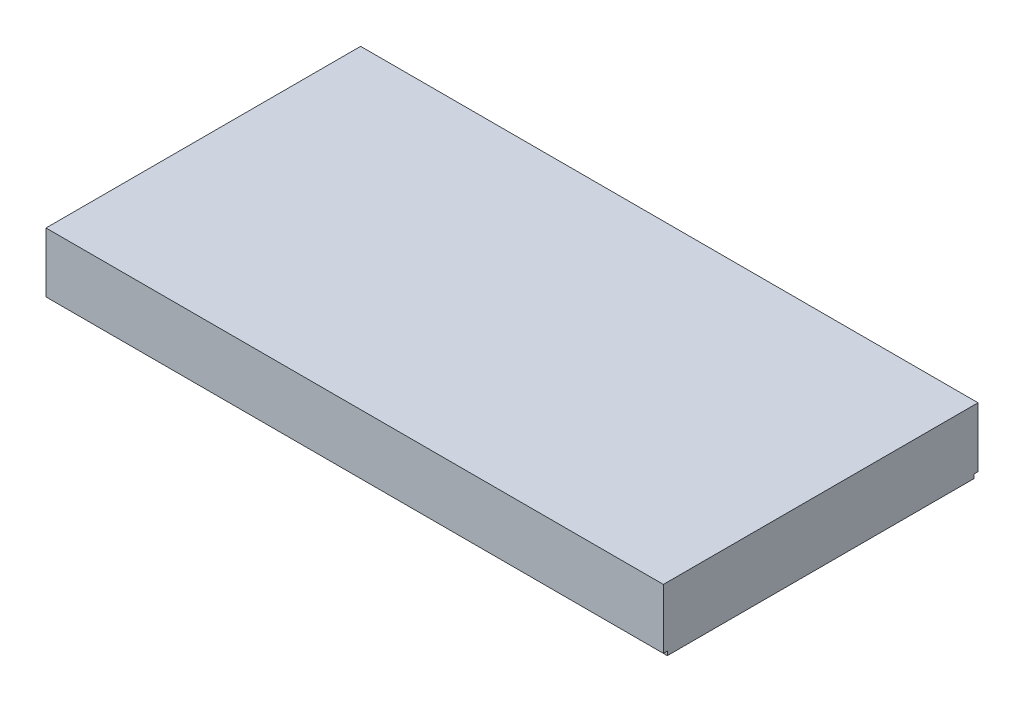
ISO-10303-21;
HEADER;
FILE_DESCRIPTION(('STEP AP214'),'2;1');
FILE_NAME('part.step','',(''),(''),'','','');
FILE_SCHEMA(('AUTOMOTIVE_DESIGN { 1 0 10303 214 1 1 1 1 }'));
ENDSEC;
DATA;
#1=APPLICATION_CONTEXT('core data for automotive mechanical design processes');
#2=APPLICATION_PROTOCOL_DEFINITION('international standard','automotive_design',2000,#1);
#3=PRODUCT_CONTEXT('',#1,'mechanical');
#4=PRODUCT('Part','Part','',(#3));
#5=PRODUCT_RELATED_PRODUCT_CATEGORY('part','',(#4));
#6=PRODUCT_DEFINITION_FORMATION('','',#4);
#7=PRODUCT_DEFINITION_CONTEXT('part definition',#1,'design');
#8=PRODUCT_DEFINITION('design','',#6,#7);
#9=PRODUCT_DEFINITION_SHAPE('','',#8);
#10=(LENGTH_UNIT() NAMED_UNIT(*) SI_UNIT(.MILLI.,.METRE.));
#11=(NAMED_UNIT(*) PLANE_ANGLE_UNIT() SI_UNIT($,.RADIAN.));
#12=(NAMED_UNIT(*) SI_UNIT($,.STERADIAN.) SOLID_ANGLE_UNIT());
#13=UNCERTAINTY_MEASURE_WITH_UNIT(LENGTH_MEASURE(1.E-05),#10,'distance_accuracy_value','');
#14=(GEOMETRIC_REPRESENTATION_CONTEXT(3) GLOBAL_UNCERTAINTY_ASSIGNED_CONTEXT((#13)) GLOBAL_UNIT_ASSIGNED_CONTEXT((#10,
#11,#12)) REPRESENTATION_CONTEXT('',''));
#15=CARTESIAN_POINT('',(0.,0.,0.));
#16=DIRECTION('',(0.,0.,1.));
#17=DIRECTION('',(1.,0.,0.));
#18=AXIS2_PLACEMENT_3D('',#15,#16,#17);
#19=CARTESIAN_POINT('',(0.681967213114738,0.,7.9));
#20=DIRECTION('',(0.,1.,0.));
#21=DIRECTION('',(0.,0.,1.));
#22=AXIS2_PLACEMENT_3D('',#19,#20,#21);
#23=PLANE('',#22);
#24=DIRECTION('',(1.,0.,0.));
#25=VECTOR('',#24,1.);
#26=CARTESIAN_POINT('',(48.2819672131147,0.,7.7));
#27=LINE('',#26,#25);
#28=CARTESIAN_POINT('',(1.09391234573703,0.,7.7));
#29=VERTEX_POINT('',#28);
#30=CARTESIAN_POINT('',(32.0973784672658,0.,7.7));
#31=VERTEX_POINT('',#30);
#32=EDGE_CURVE('E258',#29,#31,#27,.T.);
#33=ORIENTED_EDGE('',*,*,#32,.F.);
#34=DIRECTION('',(0.,0.,-1.));
#35=VECTOR('',#34,1.);
#36=CARTESIAN_POINT('',(1.09391234573703,0.,7.9));
#37=LINE('',#36,#35);
#38=CARTESIAN_POINT('',(1.09391234573703,0.,-7.7));
#39=VERTEX_POINT('',#38);
#40=EDGE_CURVE('E67',#29,#39,#37,.T.);
#41=ORIENTED_EDGE('',*,*,#40,.T.);
#42=DIRECTION('',(-1.,0.,0.));
#43=VECTOR('',#42,1.);
#44=CARTESIAN_POINT('',(0.881967213114738,0.,-7.7));
#45=LINE('',#44,#43);
#46=CARTESIAN_POINT('',(32.0973784672658,0.,-7.7));
#47=VERTEX_POINT('',#46);
#48=EDGE_CURVE('E265',#47,#39,#45,.T.);
#49=ORIENTED_EDGE('',*,*,#48,.F.);
#50=DIRECTION('',(0.,0.,1.));
#51=VECTOR('',#50,1.);
#52=CARTESIAN_POINT('',(32.0973784672658,0.,7.9));
#53=LINE('',#52,#51);
#54=EDGE_CURVE('E377',#47,#31,#53,.T.);
#55=ORIENTED_EDGE('',*,*,#54,.T.);
#56=EDGE_LOOP('',(#33,#41,#49,#55));
#57=FACE_BOUND('',#56,.T.);
#58=DIRECTION('',(0.,0.,-1.));
#59=VECTOR('',#58,1.);
#60=CARTESIAN_POINT('',(31.3093235998881,0.,6.7));
#61=LINE('',#60,#59);
#62=CARTESIAN_POINT('',(31.3093235998881,0.,6.7));
#63=VERTEX_POINT('',#62);
#64=CARTESIAN_POINT('',(31.3093235998881,0.,-6.7));
#65=VERTEX_POINT('',#64);
#66=EDGE_CURVE('E315',#63,#65,#61,.T.);
#67=ORIENTED_EDGE('',*,*,#66,.T.);
#68=DIRECTION('',(1.,0.,0.));
#69=VECTOR('',#68,1.);
#70=CARTESIAN_POINT('',(0.,0.,-6.7));
#71=LINE('',#70,#69);
#72=CARTESIAN_POINT('',(1.88196721311474,0.,-6.7));
#73=VERTEX_POINT('',#72);
#74=EDGE_CURVE('E293',#73,#65,#71,.T.);
#75=ORIENTED_EDGE('',*,*,#74,.F.);
#76=DIRECTION('',(0.,0.,-1.));
#77=VECTOR('',#76,1.);
#78=CARTESIAN_POINT('',(1.88196721311474,0.,7.9));
#79=LINE('',#78,#77);
#80=CARTESIAN_POINT('',(1.88196721311474,0.,6.7));
#81=VERTEX_POINT('',#80);
#82=EDGE_CURVE('E197',#81,#73,#79,.T.);
#83=ORIENTED_EDGE('',*,*,#82,.F.);
#84=DIRECTION('',(1.,0.,0.));
#85=VECTOR('',#84,1.);
#86=CARTESIAN_POINT('',(0.,0.,6.7));
#87=LINE('',#86,#85);
#88=EDGE_CURVE('E200',#81,#63,#87,.T.);
#89=ORIENTED_EDGE('',*,*,#88,.T.);
#90=EDGE_LOOP('',(#67,#75,#83,#89));
#91=FACE_BOUND('',#90,.T.);
#92=ADVANCED_FACE('F42',(#57,#91),#23,.F.);
#93=CARTESIAN_POINT('',(0.681967213114738,3.2,7.9));
#94=DIRECTION('',(0.,-1.,0.));
#95=DIRECTION('',(1.,0.,0.));
#96=AXIS2_PLACEMENT_3D('',#93,#94,#95);
#97=PLANE('',#96);
#98=DIRECTION('',(-1.,0.,0.));
#99=VECTOR('',#98,1.);
#100=CARTESIAN_POINT('',(0.681967213114738,3.2,-7.9));
#101=LINE('',#100,#99);
#102=CARTESIAN_POINT('',(32.0973784672658,3.2,-7.9));
#103=VERTEX_POINT('',#102);
#104=CARTESIAN_POINT('',(1.09391234573703,3.2,-7.9));
#105=VERTEX_POINT('',#104);
#106=EDGE_CURVE('E186',#103,#105,#101,.T.);
#107=ORIENTED_EDGE('',*,*,#106,.T.);
#108=DIRECTION('',(0.,0.,-1.));
#109=VECTOR('',#108,1.);
#110=CARTESIAN_POINT('',(1.09391234573703,3.2,-7.9));
#111=LINE('',#110,#109);
#112=CARTESIAN_POINT('',(1.09391234573703,3.2,7.9));
#113=VERTEX_POINT('',#112);
#114=EDGE_CURVE('E169',#113,#105,#111,.T.);
#115=ORIENTED_EDGE('',*,*,#114,.F.);
#116=DIRECTION('',(-1.,0.,0.));
#117=VECTOR('',#116,1.);
#118=CARTESIAN_POINT('',(0.681967213114738,3.2,7.9));
#119=LINE('',#118,#117);
#120=CARTESIAN_POINT('',(32.0973784672658,3.2,7.9));
#121=VERTEX_POINT('',#120);
#122=EDGE_CURVE('E184',#121,#113,#119,.T.);
#123=ORIENTED_EDGE('',*,*,#122,.F.);
#124=DIRECTION('',(0.,0.,1.));
#125=VECTOR('',#124,1.);
#126=CARTESIAN_POINT('',(32.0973784672658,3.2,-7.9));
#127=LINE('',#126,#125);
#128=EDGE_CURVE('E187',#103,#121,#127,.T.);
#129=ORIENTED_EDGE('',*,*,#128,.F.);
#130=EDGE_LOOP('',(#107,#115,#123,#129));
#131=FACE_BOUND('',#130,.T.);
#132=ADVANCED_FACE('F182',(#131),#97,.F.);
#133=CARTESIAN_POINT('',(0.,0.,7.9));
#134=DIRECTION('',(0.,0.,-1.));
#135=DIRECTION('',(-1.,0.,0.));
#136=AXIS2_PLACEMENT_3D('',#133,#134,#135);
#137=PLANE('',#136);
#138=ORIENTED_EDGE('',*,*,#122,.T.);
#139=DIRECTION('',(0.,1.,0.));
#140=VECTOR('',#139,1.);
#141=CARTESIAN_POINT('',(1.09391234573703,-0.2,7.9));
#142=LINE('',#141,#140);
#143=CARTESIAN_POINT('',(1.09391234573703,0.199766915545216,7.9));
#144=VERTEX_POINT('',#143);
#145=EDGE_CURVE('E166',#144,#113,#142,.T.);
#146=ORIENTED_EDGE('',*,*,#145,.F.);
#147=DIRECTION('',(-1.,0.,0.));
#148=VECTOR('',#147,1.);
#149=CARTESIAN_POINT('',(0.881967213114738,0.199766915545217,7.9));
#150=LINE('',#149,#148);
#151=CARTESIAN_POINT('',(32.0973784672658,0.199766915545216,7.9));
#152=VERTEX_POINT('',#151);
#153=EDGE_CURVE('E274',#152,#144,#150,.T.);
#154=ORIENTED_EDGE('',*,*,#153,.F.);
#155=DIRECTION('',(0.,1.,0.));
#156=VECTOR('',#155,1.);
#157=CARTESIAN_POINT('',(32.0973784672658,-0.2,7.9));
#158=LINE('',#157,#156);
#159=EDGE_CURVE('E191',#152,#121,#158,.T.);
#160=ORIENTED_EDGE('',*,*,#159,.T.);
#161=EDGE_LOOP('',(#138,#146,#154,#160));
#162=FACE_BOUND('',#161,.T.);
#163=ADVANCED_FACE('F190',(#162),#137,.F.);
#164=CARTESIAN_POINT('',(0.,0.,-7.9));
#165=DIRECTION('',(0.,0.,-1.));
#166=DIRECTION('',(-1.,0.,0.));
#167=AXIS2_PLACEMENT_3D('',#164,#165,#166);
#168=PLANE('',#167);
#169=DIRECTION('',(0.,1.,0.));
#170=VECTOR('',#169,1.);
#171=CARTESIAN_POINT('',(1.09391234573703,-0.2,-7.9));
#172=LINE('',#171,#170);
#173=CARTESIAN_POINT('',(1.09391234573703,0.199783174331497,-7.9));
#174=VERTEX_POINT('',#173);
#175=EDGE_CURVE('E177',#174,#105,#172,.T.);
#176=ORIENTED_EDGE('',*,*,#175,.T.);
#177=ORIENTED_EDGE('',*,*,#106,.F.);
#178=DIRECTION('',(0.,1.,0.));
#179=VECTOR('',#178,1.);
#180=CARTESIAN_POINT('',(32.0973784672658,-0.2,-7.9));
#181=LINE('',#180,#179);
#182=CARTESIAN_POINT('',(32.0973784672658,0.202161519723774,-7.9));
#183=VERTEX_POINT('',#182);
#184=EDGE_CURVE('E381',#183,#103,#181,.T.);
#185=ORIENTED_EDGE('',*,*,#184,.F.);
#186=DIRECTION('',(0.999999997057616,7.67122416557049E-05,0.));
#187=VECTOR('',#186,1.);
#188=CARTESIAN_POINT('',(48.4819672131147,0.203418418258773,-7.9));
#189=LINE('',#188,#187);
#190=EDGE_CURVE('E262',#174,#183,#189,.T.);
#191=ORIENTED_EDGE('',*,*,#190,.F.);
#192=EDGE_LOOP('',(#176,#177,#185,#191));
#193=FACE_BOUND('',#192,.T.);
#194=ADVANCED_FACE('F386',(#193),#168,.T.);
#195=CARTESIAN_POINT('',(1.88196721311474,0.,7.9));
#196=DIRECTION('',(1.,0.,0.));
#197=DIRECTION('',(0.,0.,-1.));
#198=AXIS2_PLACEMENT_3D('',#195,#196,#197);
#199=PLANE('',#198);
#200=DIRECTION('',(0.,-1.,0.));
#201=VECTOR('',#200,1.);
#202=CARTESIAN_POINT('',(1.88196721311474,2.4,-2.49948215339272));
#203=LINE('',#202,#201);
#204=CARTESIAN_POINT('',(1.88196721311474,2.2,-2.49948215339272));
#205=VERTEX_POINT('',#204);
#206=CARTESIAN_POINT('',(1.88196721311474,2.,-2.49948215339272));
#207=VERTEX_POINT('',#206);
#208=EDGE_CURVE('E336',#205,#207,#203,.T.);
#209=ORIENTED_EDGE('',*,*,#208,.F.);
#210=DIRECTION('',(0.,0.,-1.));
#211=VECTOR('',#210,1.);
#212=CARTESIAN_POINT('',(1.88196721311474,2.2,7.9));
#213=LINE('',#212,#211);
#214=CARTESIAN_POINT('',(1.88196721311474,2.2,2.50210016185098));
#215=VERTEX_POINT('',#214);
#216=EDGE_CURVE('E230',#205,#215,#213,.F.);
#217=ORIENTED_EDGE('',*,*,#216,.T.);
#218=DIRECTION('',(0.,-1.,0.));
#219=VECTOR('',#218,1.);
#220=CARTESIAN_POINT('',(1.88196721311474,2.4,2.50210016185098));
#221=LINE('',#220,#219);
#222=CARTESIAN_POINT('',(1.88196721311474,2.,2.50210016185098));
#223=VERTEX_POINT('',#222);
#224=EDGE_CURVE('E267',#215,#223,#221,.T.);
#225=ORIENTED_EDGE('',*,*,#224,.T.);
#226=DIRECTION('',(0.,0.,-1.));
#227=VECTOR('',#226,1.);
#228=CARTESIAN_POINT('',(1.88196721311474,2.,7.9));
#229=LINE('',#228,#227);
#230=CARTESIAN_POINT('',(1.88196721311474,2.,6.7));
#231=VERTEX_POINT('',#230);
#232=EDGE_CURVE('E297',#231,#223,#229,.T.);
#233=ORIENTED_EDGE('',*,*,#232,.F.);
#234=DIRECTION('',(0.,-1.,0.));
#235=VECTOR('',#234,1.);
#236=CARTESIAN_POINT('',(1.88196721311474,0.,6.7));
#237=LINE('',#236,#235);
#238=EDGE_CURVE('E294',#231,#81,#237,.T.);
#239=ORIENTED_EDGE('',*,*,#238,.T.);
#240=ORIENTED_EDGE('',*,*,#82,.T.);
#241=DIRECTION('',(0.,-1.,0.));
#242=VECTOR('',#241,1.);
#243=CARTESIAN_POINT('',(1.88196721311474,0.,-6.7));
#244=LINE('',#243,#242);
#245=CARTESIAN_POINT('',(1.88196721311474,2.,-6.7));
#246=VERTEX_POINT('',#245);
#247=EDGE_CURVE('E206',#246,#73,#244,.T.);
#248=ORIENTED_EDGE('',*,*,#247,.F.);
#249=EDGE_CURVE('E300',#207,#246,#229,.T.);
#250=ORIENTED_EDGE('',*,*,#249,.F.);
#251=EDGE_LOOP('',(#209,#217,#225,#233,#239,#240,#248,#250));
#252=FACE_BOUND('',#251,.T.);
#253=ADVANCED_FACE('F356',(#252),#199,.T.);
#254=CARTESIAN_POINT('',(0.681967213114738,2.,7.9));
#255=DIRECTION('',(0.,-1.,0.));
#256=DIRECTION('',(1.,0.,0.));
#257=AXIS2_PLACEMENT_3D('',#254,#255,#256);
#258=PLANE('',#257);
#259=DIRECTION('',(0.,0.,-1.));
#260=VECTOR('',#259,1.);
#261=CARTESIAN_POINT('',(31.3093235998881,2.,6.7));
#262=LINE('',#261,#260);
#263=CARTESIAN_POINT('',(31.3093235998881,2.,6.7));
#264=VERTEX_POINT('',#263);
#265=CARTESIAN_POINT('',(31.3093235998881,2.,-6.7));
#266=VERTEX_POINT('',#265);
#267=EDGE_CURVE('E324',#264,#266,#262,.T.);
#268=ORIENTED_EDGE('',*,*,#267,.F.);
#269=DIRECTION('',(-1.,0.,0.));
#270=VECTOR('',#269,1.);
#271=CARTESIAN_POINT('',(0.,2.,6.7));
#272=LINE('',#271,#270);
#273=EDGE_CURVE('E302',#264,#231,#272,.T.);
#274=ORIENTED_EDGE('',*,*,#273,.T.);
#275=ORIENTED_EDGE('',*,*,#232,.T.);
#276=DIRECTION('',(-1.,0.,0.));
#277=VECTOR('',#276,1.);
#278=CARTESIAN_POINT('',(1.88196721311474,2.,2.50210016185098));
#279=LINE('',#278,#277);
#280=CARTESIAN_POINT('',(2.38194248084373,2.,2.50210016185098));
#281=VERTEX_POINT('',#280);
#282=EDGE_CURVE('E333',#281,#223,#279,.T.);
#283=ORIENTED_EDGE('',*,*,#282,.F.);
#284=DIRECTION('',(0.,0.,1.));
#285=VECTOR('',#284,1.);
#286=CARTESIAN_POINT('',(2.38194248084373,2.,2.50210016185098));
#287=LINE('',#286,#285);
#288=CARTESIAN_POINT('',(2.38194248084373,2.,-2.49948215339272));
#289=VERTEX_POINT('',#288);
#290=EDGE_CURVE('E330',#289,#281,#287,.T.);
#291=ORIENTED_EDGE('',*,*,#290,.F.);
#292=DIRECTION('',(1.,0.,0.));
#293=VECTOR('',#292,1.);
#294=CARTESIAN_POINT('',(2.38194248084373,2.,-2.49948215339272));
#295=LINE('',#294,#293);
#296=EDGE_CURVE('E250',#207,#289,#295,.T.);
#297=ORIENTED_EDGE('',*,*,#296,.F.);
#298=ORIENTED_EDGE('',*,*,#249,.T.);
#299=DIRECTION('',(-1.,0.,0.));
#300=VECTOR('',#299,1.);
#301=CARTESIAN_POINT('',(0.,2.,-6.7));
#302=LINE('',#301,#300);
#303=EDGE_CURVE('E296',#266,#246,#302,.T.);
#304=ORIENTED_EDGE('',*,*,#303,.F.);
#305=EDGE_LOOP('',(#268,#274,#275,#283,#291,#297,#298,#304));
#306=FACE_BOUND('',#305,.T.);
#307=CARTESIAN_POINT('',(16.5819672131147,2.,0.));
#308=DIRECTION('',(0.,-1.,0.));
#309=DIRECTION('',(1.,0.,0.));
#310=AXIS2_PLACEMENT_3D('',#307,#308,#309);
#311=CIRCLE('',#310,3.1);
#312=CARTESIAN_POINT('',(19.6819672131147,2.,0.));
#313=VERTEX_POINT('',#312);
#314=EDGE_CURVE('E214',#313,#313,#311,.F.);
#315=ORIENTED_EDGE('',*,*,#314,.T.);
#316=EDGE_LOOP('',(#315));
#317=FACE_BOUND('',#316,.T.);
#318=CARTESIAN_POINT('',(24.5819672131147,2.,0.));
#319=DIRECTION('',(0.,-1.,0.));
#320=DIRECTION('',(1.,0.,0.));
#321=AXIS2_PLACEMENT_3D('',#318,#319,#320);
#322=CIRCLE('',#321,3.1);
#323=CARTESIAN_POINT('',(27.6819672131147,2.,0.));
#324=VERTEX_POINT('',#323);
#325=EDGE_CURVE('E211',#324,#324,#322,.F.);
#326=ORIENTED_EDGE('',*,*,#325,.T.);
#327=EDGE_LOOP('',(#326));
#328=FACE_BOUND('',#327,.T.);
#329=CARTESIAN_POINT('',(8.58196721311474,2.,0.));
#330=DIRECTION('',(0.,-1.,0.));
#331=DIRECTION('',(1.,0.,0.));
#332=AXIS2_PLACEMENT_3D('',#329,#330,#331);
#333=CIRCLE('',#332,3.1);
#334=CARTESIAN_POINT('',(11.6819672131147,2.,0.));
#335=VERTEX_POINT('',#334);
#336=EDGE_CURVE('E203',#335,#335,#333,.F.);
#337=ORIENTED_EDGE('',*,*,#336,.T.);
#338=EDGE_LOOP('',(#337));
#339=FACE_BOUND('',#338,.T.);
#340=ADVANCED_FACE('F353',(#306,#317,#328,#339),#258,.T.);
#341=CARTESIAN_POINT('',(0.,0.,6.7));
#342=DIRECTION('',(0.,0.,-1.));
#343=DIRECTION('',(-1.,0.,0.));
#344=AXIS2_PLACEMENT_3D('',#341,#342,#343);
#345=PLANE('',#344);
#346=DIRECTION('',(0.,1.,0.));
#347=VECTOR('',#346,1.);
#348=CARTESIAN_POINT('',(31.3093235998881,0.,6.7));
#349=LINE('',#348,#347);
#350=EDGE_CURVE('E319',#63,#264,#349,.T.);
#351=ORIENTED_EDGE('',*,*,#350,.F.);
#352=ORIENTED_EDGE('',*,*,#88,.F.);
#353=ORIENTED_EDGE('',*,*,#238,.F.);
#354=ORIENTED_EDGE('',*,*,#273,.F.);
#355=EDGE_LOOP('',(#351,#352,#353,#354));
#356=FACE_BOUND('',#355,.T.);
#357=ADVANCED_FACE('F361',(#356),#345,.T.);
#358=CARTESIAN_POINT('',(0.,0.,-6.7));
#359=DIRECTION('',(0.,0.,-1.));
#360=DIRECTION('',(-1.,0.,0.));
#361=AXIS2_PLACEMENT_3D('',#358,#359,#360);
#362=PLANE('',#361);
#363=ORIENTED_EDGE('',*,*,#74,.T.);
#364=DIRECTION('',(0.,1.,0.));
#365=VECTOR('',#364,1.);
#366=CARTESIAN_POINT('',(31.3093235998881,0.,-6.7));
#367=LINE('',#366,#365);
#368=EDGE_CURVE('E242',#65,#266,#367,.T.);
#369=ORIENTED_EDGE('',*,*,#368,.T.);
#370=ORIENTED_EDGE('',*,*,#303,.T.);
#371=ORIENTED_EDGE('',*,*,#247,.T.);
#372=EDGE_LOOP('',(#363,#369,#370,#371));
#373=FACE_BOUND('',#372,.T.);
#374=ADVANCED_FACE('F308',(#373),#362,.F.);
#375=CARTESIAN_POINT('',(8.58196721311474,-0.2,0.));
#376=DIRECTION('',(0.,-1.,0.));
#377=DIRECTION('',(0.,0.,-1.));
#378=AXIS2_PLACEMENT_3D('',#375,#376,#377);
#379=PLANE('',#378);
#380=CARTESIAN_POINT('',(8.58196721311474,-0.2,0.));
#381=DIRECTION('',(0.,-1.,0.));
#382=DIRECTION('',(0.,0.,-1.));
#383=AXIS2_PLACEMENT_3D('',#380,#381,#382);
#384=CIRCLE('',#383,3.1);
#385=CARTESIAN_POINT('',(8.58196721311474,-0.2,-3.1));
#386=VERTEX_POINT('',#385);
#387=EDGE_CURVE('E207',#386,#386,#384,.T.);
#388=ORIENTED_EDGE('',*,*,#387,.T.);
#389=EDGE_LOOP('',(#388));
#390=FACE_BOUND('',#389,.T.);
#391=CARTESIAN_POINT('',(8.58196721311474,-0.2,0.));
#392=DIRECTION('',(0.,-1.,0.));
#393=DIRECTION('',(0.,0.,-1.));
#394=AXIS2_PLACEMENT_3D('',#391,#392,#393);
#395=CIRCLE('',#394,2.4);
#396=CARTESIAN_POINT('',(8.58196721311474,-0.2,-2.4));
#397=VERTEX_POINT('',#396);
#398=EDGE_CURVE('E221',#397,#397,#395,.T.);
#399=ORIENTED_EDGE('',*,*,#398,.F.);
#400=EDGE_LOOP('',(#399));
#401=FACE_BOUND('',#400,.T.);
#402=ADVANCED_FACE('F496',(#390,#401),#379,.T.);
#403=CARTESIAN_POINT('',(8.58196721311474,-0.2,0.));
#404=DIRECTION('',(0.,1.,0.));
#405=DIRECTION('',(0.,0.,1.));
#406=AXIS2_PLACEMENT_3D('',#403,#404,#405);
#407=CYLINDRICAL_SURFACE('',#406,3.1);
#408=ORIENTED_EDGE('',*,*,#336,.F.);
#409=EDGE_LOOP('',(#408));
#410=FACE_BOUND('',#409,.T.);
#411=ORIENTED_EDGE('',*,*,#387,.F.);
#412=EDGE_LOOP('',(#411));
#413=FACE_BOUND('',#412,.T.);
#414=ADVANCED_FACE('F494',(#410,#413),#407,.T.);
#415=CARTESIAN_POINT('',(8.58196721311474,-0.2,0.));
#416=DIRECTION('',(0.,1.,0.));
#417=DIRECTION('',(0.,0.,1.));
#418=AXIS2_PLACEMENT_3D('',#415,#416,#417);
#419=CYLINDRICAL_SURFACE('',#418,2.4);
#420=CARTESIAN_POINT('',(8.58196721311474,2.,0.));
#421=DIRECTION('',(0.,-1.,0.));
#422=DIRECTION('',(1.,0.,0.));
#423=AXIS2_PLACEMENT_3D('',#420,#421,#422);
#424=CIRCLE('',#423,2.4);
#425=CARTESIAN_POINT('',(10.9819672131147,2.,0.));
#426=VERTEX_POINT('',#425);
#427=EDGE_CURVE('E192',#426,#426,#424,.F.);
#428=ORIENTED_EDGE('',*,*,#427,.T.);
#429=EDGE_LOOP('',(#428));
#430=FACE_BOUND('',#429,.T.);
#431=ORIENTED_EDGE('',*,*,#398,.T.);
#432=EDGE_LOOP('',(#431));
#433=FACE_BOUND('',#432,.T.);
#434=ADVANCED_FACE('F491',(#430,#433),#419,.F.);
#435=ORIENTED_EDGE('',*,*,#427,.F.);
#436=EDGE_LOOP('',(#435));
#437=FACE_BOUND('',#436,.T.);
#438=ADVANCED_FACE('F486',(#437),#258,.T.);
#439=CARTESIAN_POINT('',(24.5819672131147,-0.2,0.));
#440=DIRECTION('',(0.,-1.,0.));
#441=DIRECTION('',(0.,0.,-1.));
#442=AXIS2_PLACEMENT_3D('',#439,#440,#441);
#443=PLANE('',#442);
#444=CARTESIAN_POINT('',(24.5819672131147,-0.2,0.));
#445=DIRECTION('',(0.,-1.,0.));
#446=DIRECTION('',(0.,0.,-1.));
#447=AXIS2_PLACEMENT_3D('',#444,#445,#446);
#448=CIRCLE('',#447,3.1);
#449=CARTESIAN_POINT('',(24.5819672131147,-0.2,-3.1));
#450=VERTEX_POINT('',#449);
#451=EDGE_CURVE('E280',#450,#450,#448,.T.);
#452=ORIENTED_EDGE('',*,*,#451,.T.);
#453=EDGE_LOOP('',(#452));
#454=FACE_BOUND('',#453,.T.);
#455=CARTESIAN_POINT('',(24.5819672131147,-0.2,0.));
#456=DIRECTION('',(0.,-1.,0.));
#457=DIRECTION('',(0.,0.,-1.));
#458=AXIS2_PLACEMENT_3D('',#455,#456,#457);
#459=CIRCLE('',#458,2.4);
#460=CARTESIAN_POINT('',(24.5819672131147,-0.2,-2.4));
#461=VERTEX_POINT('',#460);
#462=EDGE_CURVE('E276',#461,#461,#459,.T.);
#463=ORIENTED_EDGE('',*,*,#462,.F.);
#464=EDGE_LOOP('',(#463));
#465=FACE_BOUND('',#464,.T.);
#466=ADVANCED_FACE('F483',(#454,#465),#443,.T.);
#467=CARTESIAN_POINT('',(24.5819672131147,-0.2,0.));
#468=DIRECTION('',(0.,1.,0.));
#469=DIRECTION('',(0.,0.,1.));
#470=AXIS2_PLACEMENT_3D('',#467,#468,#469);
#471=CYLINDRICAL_SURFACE('',#470,3.1);
#472=ORIENTED_EDGE('',*,*,#325,.F.);
#473=EDGE_LOOP('',(#472));
#474=FACE_BOUND('',#473,.T.);
#475=ORIENTED_EDGE('',*,*,#451,.F.);
#476=EDGE_LOOP('',(#475));
#477=FACE_BOUND('',#476,.T.);
#478=ADVANCED_FACE('F481',(#474,#477),#471,.T.);
#479=CARTESIAN_POINT('',(24.5819672131147,-0.2,0.));
#480=DIRECTION('',(0.,1.,0.));
#481=DIRECTION('',(0.,0.,1.));
#482=AXIS2_PLACEMENT_3D('',#479,#480,#481);
#483=CYLINDRICAL_SURFACE('',#482,2.4);
#484=CARTESIAN_POINT('',(24.5819672131147,2.,0.));
#485=DIRECTION('',(0.,-1.,0.));
#486=DIRECTION('',(1.,0.,0.));
#487=AXIS2_PLACEMENT_3D('',#484,#485,#486);
#488=CIRCLE('',#487,2.4);
#489=CARTESIAN_POINT('',(26.9819672131147,2.,0.));
#490=VERTEX_POINT('',#489);
#491=EDGE_CURVE('E195',#490,#490,#488,.F.);
#492=ORIENTED_EDGE('',*,*,#491,.T.);
#493=EDGE_LOOP('',(#492));
#494=FACE_BOUND('',#493,.T.);
#495=ORIENTED_EDGE('',*,*,#462,.T.);
#496=EDGE_LOOP('',(#495));
#497=FACE_BOUND('',#496,.T.);
#498=ADVANCED_FACE('F478',(#494,#497),#483,.F.);
#499=ORIENTED_EDGE('',*,*,#491,.F.);
#500=EDGE_LOOP('',(#499));
#501=FACE_BOUND('',#500,.T.);
#502=ADVANCED_FACE('F473',(#501),#258,.T.);
#503=CARTESIAN_POINT('',(16.5819672131147,-0.2,0.));
#504=DIRECTION('',(0.,-1.,0.));
#505=DIRECTION('',(0.,0.,-1.));
#506=AXIS2_PLACEMENT_3D('',#503,#504,#505);
#507=PLANE('',#506);
#508=CARTESIAN_POINT('',(16.5819672131147,-0.2,0.));
#509=DIRECTION('',(0.,-1.,0.));
#510=DIRECTION('',(0.,0.,-1.));
#511=AXIS2_PLACEMENT_3D('',#508,#509,#510);
#512=CIRCLE('',#511,3.1);
#513=CARTESIAN_POINT('',(16.5819672131147,-0.2,-3.1));
#514=VERTEX_POINT('',#513);
#515=EDGE_CURVE('E215',#514,#514,#512,.T.);
#516=ORIENTED_EDGE('',*,*,#515,.T.);
#517=EDGE_LOOP('',(#516));
#518=FACE_BOUND('',#517,.T.);
#519=CARTESIAN_POINT('',(16.5819672131147,-0.2,0.));
#520=DIRECTION('',(0.,-1.,0.));
#521=DIRECTION('',(0.,0.,-1.));
#522=AXIS2_PLACEMENT_3D('',#519,#520,#521);
#523=CIRCLE('',#522,2.4);
#524=CARTESIAN_POINT('',(16.5819672131147,-0.2,-2.4));
#525=VERTEX_POINT('',#524);
#526=EDGE_CURVE('E277',#525,#525,#523,.T.);
#527=ORIENTED_EDGE('',*,*,#526,.F.);
#528=EDGE_LOOP('',(#527));
#529=FACE_BOUND('',#528,.T.);
#530=ADVANCED_FACE('F470',(#518,#529),#507,.T.);
#531=CARTESIAN_POINT('',(16.5819672131147,-0.2,0.));
#532=DIRECTION('',(0.,1.,0.));
#533=DIRECTION('',(0.,0.,1.));
#534=AXIS2_PLACEMENT_3D('',#531,#532,#533);
#535=CYLINDRICAL_SURFACE('',#534,3.1);
#536=ORIENTED_EDGE('',*,*,#314,.F.);
#537=EDGE_LOOP('',(#536));
#538=FACE_BOUND('',#537,.T.);
#539=ORIENTED_EDGE('',*,*,#515,.F.);
#540=EDGE_LOOP('',(#539));
#541=FACE_BOUND('',#540,.T.);
#542=ADVANCED_FACE('F468',(#538,#541),#535,.T.);
#543=CARTESIAN_POINT('',(16.5819672131147,-0.2,0.));
#544=DIRECTION('',(0.,1.,0.));
#545=DIRECTION('',(0.,0.,1.));
#546=AXIS2_PLACEMENT_3D('',#543,#544,#545);
#547=CYLINDRICAL_SURFACE('',#546,2.4);
#548=CARTESIAN_POINT('',(16.5819672131147,2.,0.));
#549=DIRECTION('',(0.,-1.,0.));
#550=DIRECTION('',(1.,0.,0.));
#551=AXIS2_PLACEMENT_3D('',#548,#549,#550);
#552=CIRCLE('',#551,2.4);
#553=CARTESIAN_POINT('',(18.9819672131147,2.,0.));
#554=VERTEX_POINT('',#553);
#555=EDGE_CURVE('E210',#554,#554,#552,.F.);
#556=ORIENTED_EDGE('',*,*,#555,.T.);
#557=EDGE_LOOP('',(#556));
#558=FACE_BOUND('',#557,.T.);
#559=ORIENTED_EDGE('',*,*,#526,.T.);
#560=EDGE_LOOP('',(#559));
#561=FACE_BOUND('',#560,.T.);
#562=ADVANCED_FACE('F465',(#558,#561),#547,.F.);
#563=ORIENTED_EDGE('',*,*,#555,.F.);
#564=EDGE_LOOP('',(#563));
#565=FACE_BOUND('',#564,.T.);
#566=ADVANCED_FACE('F464',(#565),#258,.T.);
#567=CARTESIAN_POINT('',(0.881967213114738,0.199766915545216,-7.9));
#568=DIRECTION('',(0.,1.,0.));
#569=DIRECTION('',(0.,0.,1.));
#570=AXIS2_PLACEMENT_3D('',#567,#568,#569);
#571=PLANE('',#570);
#572=ORIENTED_EDGE('',*,*,#153,.T.);
#573=DIRECTION('',(0.,0.,-1.));
#574=VECTOR('',#573,1.);
#575=CARTESIAN_POINT('',(1.09391234573703,0.199766915545216,-7.9));
#576=LINE('',#575,#574);
#577=CARTESIAN_POINT('',(1.09391234573703,0.199766915545217,7.7));
#578=VERTEX_POINT('',#577);
#579=EDGE_CURVE('E172',#144,#578,#576,.T.);
#580=ORIENTED_EDGE('',*,*,#579,.T.);
#581=DIRECTION('',(-1.,0.,0.));
#582=VECTOR('',#581,1.);
#583=CARTESIAN_POINT('',(0.881967213114738,0.199766915545217,7.7));
#584=LINE('',#583,#582);
#585=CARTESIAN_POINT('',(32.0973784672658,0.199766915545217,7.7));
#586=VERTEX_POINT('',#585);
#587=EDGE_CURVE('E256',#586,#578,#584,.T.);
#588=ORIENTED_EDGE('',*,*,#587,.F.);
#589=DIRECTION('',(0.,0.,1.));
#590=VECTOR('',#589,1.);
#591=CARTESIAN_POINT('',(32.0973784672658,0.199766915545216,-7.9));
#592=LINE('',#591,#590);
#593=EDGE_CURVE('E59',#586,#152,#592,.T.);
#594=ORIENTED_EDGE('',*,*,#593,.T.);
#595=EDGE_LOOP('',(#572,#580,#588,#594));
#596=FACE_BOUND('',#595,.T.);
#597=ADVANCED_FACE('F261',(#596),#571,.F.);
#598=CARTESIAN_POINT('',(48.4819672131147,0.203418418258773,-7.7));
#599=DIRECTION('',(-7.67122416557049E-05,0.999999997057616,0.));
#600=DIRECTION('',(-0.999999997057616,-7.67122416557049E-05,0.));
#601=AXIS2_PLACEMENT_3D('',#598,#599,#600);
#602=PLANE('',#601);
#603=DIRECTION('',(0.999999997057616,7.67122416557049E-05,0.));
#604=VECTOR('',#603,1.);
#605=CARTESIAN_POINT('',(48.4819672131147,0.203418418258773,-7.7));
#606=LINE('',#605,#604);
#607=CARTESIAN_POINT('',(1.09391234573703,0.199783174331497,-7.7));
#608=VERTEX_POINT('',#607);
#609=CARTESIAN_POINT('',(32.0973784672658,0.202161519723774,-7.7));
#610=VERTEX_POINT('',#609);
#611=EDGE_CURVE('E46',#608,#610,#606,.T.);
#612=ORIENTED_EDGE('',*,*,#611,.F.);
#613=DIRECTION('',(0.,0.,-1.));
#614=VECTOR('',#613,1.);
#615=CARTESIAN_POINT('',(1.09391234573703,0.199783174331497,-7.69999999999999));
#616=LINE('',#615,#614);
#617=EDGE_CURVE('E320',#608,#174,#616,.T.);
#618=ORIENTED_EDGE('',*,*,#617,.T.);
#619=ORIENTED_EDGE('',*,*,#190,.T.);
#620=DIRECTION('',(0.,0.,1.));
#621=VECTOR('',#620,1.);
#622=CARTESIAN_POINT('',(32.0973784672658,0.202161519723774,-7.7));
#623=LINE('',#622,#621);
#624=EDGE_CURVE('E371',#183,#610,#623,.T.);
#625=ORIENTED_EDGE('',*,*,#624,.T.);
#626=EDGE_LOOP('',(#612,#618,#619,#625));
#627=FACE_BOUND('',#626,.T.);
#628=ADVANCED_FACE('F390',(#627),#602,.F.);
#629=CARTESIAN_POINT('',(0.,0.,-7.7));
#630=DIRECTION('',(0.,0.,1.));
#631=DIRECTION('',(1.,0.,0.));
#632=AXIS2_PLACEMENT_3D('',#629,#630,#631);
#633=PLANE('',#632);
#634=ORIENTED_EDGE('',*,*,#48,.T.);
#635=DIRECTION('',(0.,1.,0.));
#636=VECTOR('',#635,1.);
#637=CARTESIAN_POINT('',(1.09391234573703,0.,-7.7));
#638=LINE('',#637,#636);
#639=EDGE_CURVE('E366',#39,#608,#638,.T.);
#640=ORIENTED_EDGE('',*,*,#639,.T.);
#641=ORIENTED_EDGE('',*,*,#611,.T.);
#642=DIRECTION('',(0.,-1.,0.));
#643=VECTOR('',#642,1.);
#644=CARTESIAN_POINT('',(32.0973784672658,0.,-7.7));
#645=LINE('',#644,#643);
#646=EDGE_CURVE('E374',#610,#47,#645,.T.);
#647=ORIENTED_EDGE('',*,*,#646,.T.);
#648=EDGE_LOOP('',(#634,#640,#641,#647));
#649=FACE_BOUND('',#648,.T.);
#650=ADVANCED_FACE('F393',(#649),#633,.F.);
#651=CARTESIAN_POINT('',(0.,0.,7.7));
#652=DIRECTION('',(0.,0.,-1.));
#653=DIRECTION('',(-1.,0.,0.));
#654=AXIS2_PLACEMENT_3D('',#651,#652,#653);
#655=PLANE('',#654);
#656=ORIENTED_EDGE('',*,*,#587,.T.);
#657=DIRECTION('',(0.,-1.,0.));
#658=VECTOR('',#657,1.);
#659=CARTESIAN_POINT('',(1.09391234573703,0.,7.7));
#660=LINE('',#659,#658);
#661=EDGE_CURVE('E11',#578,#29,#660,.T.);
#662=ORIENTED_EDGE('',*,*,#661,.T.);
#663=ORIENTED_EDGE('',*,*,#32,.T.);
#664=DIRECTION('',(0.,1.,0.));
#665=VECTOR('',#664,1.);
#666=CARTESIAN_POINT('',(32.0973784672658,0.,7.7));
#667=LINE('',#666,#665);
#668=EDGE_CURVE('E52',#31,#586,#667,.T.);
#669=ORIENTED_EDGE('',*,*,#668,.T.);
#670=EDGE_LOOP('',(#656,#662,#663,#669));
#671=FACE_BOUND('',#670,.T.);
#672=ADVANCED_FACE('F255',(#671),#655,.F.);
#673=CARTESIAN_POINT('',(1.88196721311474,2.4,2.50210016185098));
#674=DIRECTION('',(0.,0.,1.));
#675=DIRECTION('',(1.,0.,0.));
#676=AXIS2_PLACEMENT_3D('',#673,#674,#675);
#677=PLANE('',#676);
#678=ORIENTED_EDGE('',*,*,#224,.F.);
#679=DIRECTION('',(-1.,0.,0.));
#680=VECTOR('',#679,1.);
#681=CARTESIAN_POINT('',(2.38194248084373,2.2,2.50210016185098));
#682=LINE('',#681,#680);
#683=CARTESIAN_POINT('',(2.38194248084373,2.2,2.50210016185098));
#684=VERTEX_POINT('',#683);
#685=EDGE_CURVE('E237',#215,#684,#682,.F.);
#686=ORIENTED_EDGE('',*,*,#685,.T.);
#687=DIRECTION('',(0.,-1.,0.));
#688=VECTOR('',#687,1.);
#689=CARTESIAN_POINT('',(2.38194248084373,2.4,2.50210016185098));
#690=LINE('',#689,#688);
#691=EDGE_CURVE('E338',#684,#281,#690,.T.);
#692=ORIENTED_EDGE('',*,*,#691,.T.);
#693=ORIENTED_EDGE('',*,*,#282,.T.);
#694=EDGE_LOOP('',(#678,#686,#692,#693));
#695=FACE_BOUND('',#694,.T.);
#696=ADVANCED_FACE('F441',(#695),#677,.F.);
#697=CARTESIAN_POINT('',(2.38194248084373,2.4,2.50210016185098));
#698=DIRECTION('',(1.,0.,0.));
#699=DIRECTION('',(0.,1.,0.));
#700=AXIS2_PLACEMENT_3D('',#697,#698,#699);
#701=PLANE('',#700);
#702=ORIENTED_EDGE('',*,*,#691,.F.);
#703=DIRECTION('',(0.,0.,1.));
#704=VECTOR('',#703,1.);
#705=CARTESIAN_POINT('',(2.38194248084373,2.2,-2.49948215339272));
#706=LINE('',#705,#704);
#707=CARTESIAN_POINT('',(2.38194248084373,2.2,-2.49948215339272));
#708=VERTEX_POINT('',#707);
#709=EDGE_CURVE('E233',#684,#708,#706,.F.);
#710=ORIENTED_EDGE('',*,*,#709,.T.);
#711=DIRECTION('',(0.,-1.,0.));
#712=VECTOR('',#711,1.);
#713=CARTESIAN_POINT('',(2.38194248084373,2.4,-2.49948215339272));
#714=LINE('',#713,#712);
#715=EDGE_CURVE('E340',#708,#289,#714,.T.);
#716=ORIENTED_EDGE('',*,*,#715,.T.);
#717=ORIENTED_EDGE('',*,*,#290,.T.);
#718=EDGE_LOOP('',(#702,#710,#716,#717));
#719=FACE_BOUND('',#718,.T.);
#720=ADVANCED_FACE('F438',(#719),#701,.F.);
#721=CARTESIAN_POINT('',(2.38194248084373,2.4,-2.49948215339272));
#722=DIRECTION('',(0.,0.,-1.));
#723=DIRECTION('',(-1.,0.,0.));
#724=AXIS2_PLACEMENT_3D('',#721,#722,#723);
#725=PLANE('',#724);
#726=ORIENTED_EDGE('',*,*,#715,.F.);
#727=DIRECTION('',(1.,0.,0.));
#728=VECTOR('',#727,1.);
#729=CARTESIAN_POINT('',(1.88196721311474,2.2,-2.49948215339272));
#730=LINE('',#729,#728);
#731=EDGE_CURVE('E235',#708,#205,#730,.F.);
#732=ORIENTED_EDGE('',*,*,#731,.T.);
#733=ORIENTED_EDGE('',*,*,#208,.T.);
#734=ORIENTED_EDGE('',*,*,#296,.T.);
#735=EDGE_LOOP('',(#726,#732,#733,#734));
#736=FACE_BOUND('',#735,.T.);
#737=ADVANCED_FACE('F345',(#736),#725,.F.);
#738=CARTESIAN_POINT('',(0.,2.4,0.));
#739=DIRECTION('',(0.,1.,0.));
#740=DIRECTION('',(0.,0.,1.));
#741=AXIS2_PLACEMENT_3D('',#738,#739,#740);
#742=PLANE('',#741);
#743=DIRECTION('',(0.,0.,-1.));
#744=VECTOR('',#743,1.);
#745=CARTESIAN_POINT('',(2.08196721311474,2.4,0.));
#746=LINE('',#745,#744);
#747=CARTESIAN_POINT('',(2.08196721311474,2.4,2.30210016185098));
#748=VERTEX_POINT('',#747);
#749=CARTESIAN_POINT('',(2.08196721311474,2.4,-2.29948215339272));
#750=VERTEX_POINT('',#749);
#751=EDGE_CURVE('E225',#748,#750,#746,.T.);
#752=ORIENTED_EDGE('',*,*,#751,.T.);
#753=DIRECTION('',(1.,0.,0.));
#754=VECTOR('',#753,1.);
#755=CARTESIAN_POINT('',(2.38194248084373,2.4,-2.29948215339272));
#756=LINE('',#755,#754);
#757=CARTESIAN_POINT('',(2.18194248084373,2.4,-2.29948215339272));
#758=VERTEX_POINT('',#757);
#759=EDGE_CURVE('E228',#750,#758,#756,.T.);
#760=ORIENTED_EDGE('',*,*,#759,.T.);
#761=DIRECTION('',(0.,0.,1.));
#762=VECTOR('',#761,1.);
#763=CARTESIAN_POINT('',(2.18194248084373,2.4,2.50210016185098));
#764=LINE('',#763,#762);
#765=CARTESIAN_POINT('',(2.18194248084373,2.4,2.30210016185098));
#766=VERTEX_POINT('',#765);
#767=EDGE_CURVE('E223',#758,#766,#764,.T.);
#768=ORIENTED_EDGE('',*,*,#767,.T.);
#769=DIRECTION('',(-1.,0.,0.));
#770=VECTOR('',#769,1.);
#771=CARTESIAN_POINT('',(1.88196721311474,2.4,2.30210016185098));
#772=LINE('',#771,#770);
#773=EDGE_CURVE('E218',#766,#748,#772,.T.);
#774=ORIENTED_EDGE('',*,*,#773,.T.);
#775=EDGE_LOOP('',(#752,#760,#768,#774));
#776=FACE_BOUND('',#775,.T.);
#777=ADVANCED_FACE('F427',(#776),#742,.F.);
#778=CARTESIAN_POINT('',(2.18194248084373,2.2,0.));
#779=DIRECTION('',(0.,0.,-1.));
#780=DIRECTION('',(-1.,0.,0.));
#781=AXIS2_PLACEMENT_3D('',#778,#779,#780);
#782=CYLINDRICAL_SURFACE('',#781,0.2);
#783=CARTESIAN_POINT('',(2.18194248084373,2.2,-2.29948215339272));
#784=DIRECTION('',(-0.707106781186547,0.,-0.707106781186547));
#785=DIRECTION('',(0.707106781186547,0.,-0.707106781186547));
#786=AXIS2_PLACEMENT_3D('',#783,#784,#785);
#787=ELLIPSE('',#786,0.282842712474619,0.2);
#788=EDGE_CURVE('E244',#708,#758,#787,.F.);
#789=ORIENTED_EDGE('',*,*,#788,.F.);
#790=ORIENTED_EDGE('',*,*,#709,.F.);
#791=CARTESIAN_POINT('',(2.18194248084373,2.2,2.30210016185098));
#792=DIRECTION('',(0.707106781186547,0.,-0.707106781186547));
#793=DIRECTION('',(-0.707106781186547,0.,-0.707106781186547));
#794=AXIS2_PLACEMENT_3D('',#791,#792,#793);
#795=ELLIPSE('',#794,0.282842712474619,0.2);
#796=EDGE_CURVE('E247',#766,#684,#795,.T.);
#797=ORIENTED_EDGE('',*,*,#796,.F.);
#798=ORIENTED_EDGE('',*,*,#767,.F.);
#799=EDGE_LOOP('',(#789,#790,#797,#798));
#800=FACE_BOUND('',#799,.T.);
#801=ADVANCED_FACE('F44',(#800),#782,.F.);
#802=CARTESIAN_POINT('',(0.,2.2,2.30210016185098));
#803=DIRECTION('',(1.,0.,0.));
#804=DIRECTION('',(0.,0.,-1.));
#805=AXIS2_PLACEMENT_3D('',#802,#803,#804);
#806=CYLINDRICAL_SURFACE('',#805,0.2);
#807=ORIENTED_EDGE('',*,*,#796,.T.);
#808=ORIENTED_EDGE('',*,*,#685,.F.);
#809=CARTESIAN_POINT('',(2.08196721311474,2.2,2.30210016185098));
#810=DIRECTION('',(-0.707106781186547,0.,-0.707106781186547));
#811=DIRECTION('',(0.707106781186547,0.,-0.707106781186547));
#812=AXIS2_PLACEMENT_3D('',#809,#810,#811);
#813=ELLIPSE('',#812,0.282842712474619,0.2);
#814=EDGE_CURVE('E241',#748,#215,#813,.F.);
#815=ORIENTED_EDGE('',*,*,#814,.F.);
#816=ORIENTED_EDGE('',*,*,#773,.F.);
#817=EDGE_LOOP('',(#807,#808,#815,#816));
#818=FACE_BOUND('',#817,.T.);
#819=ADVANCED_FACE('F420',(#818),#806,.F.);
#820=CARTESIAN_POINT('',(0.,2.2,-2.29948215339272));
#821=DIRECTION('',(-1.,0.,0.));
#822=DIRECTION('',(0.,0.,1.));
#823=AXIS2_PLACEMENT_3D('',#820,#821,#822);
#824=CYLINDRICAL_SURFACE('',#823,0.2);
#825=ORIENTED_EDGE('',*,*,#788,.T.);
#826=ORIENTED_EDGE('',*,*,#759,.F.);
#827=CARTESIAN_POINT('',(2.08196721311474,2.2,-2.29948215339272));
#828=DIRECTION('',(0.707106781186547,0.,-0.707106781186547));
#829=DIRECTION('',(-0.707106781186547,0.,-0.707106781186547));
#830=AXIS2_PLACEMENT_3D('',#827,#828,#829);
#831=ELLIPSE('',#830,0.282842712474619,0.2);
#832=EDGE_CURVE('E239',#205,#750,#831,.T.);
#833=ORIENTED_EDGE('',*,*,#832,.F.);
#834=ORIENTED_EDGE('',*,*,#731,.F.);
#835=EDGE_LOOP('',(#825,#826,#833,#834));
#836=FACE_BOUND('',#835,.T.);
#837=ADVANCED_FACE('F417',(#836),#824,.F.);
#838=CARTESIAN_POINT('',(2.08196721311474,2.2,0.));
#839=DIRECTION('',(0.,0.,-1.));
#840=DIRECTION('',(-1.,0.,0.));
#841=AXIS2_PLACEMENT_3D('',#838,#839,#840);
#842=CYLINDRICAL_SURFACE('',#841,0.2);
#843=ORIENTED_EDGE('',*,*,#814,.T.);
#844=ORIENTED_EDGE('',*,*,#216,.F.);
#845=ORIENTED_EDGE('',*,*,#832,.T.);
#846=ORIENTED_EDGE('',*,*,#751,.F.);
#847=EDGE_LOOP('',(#843,#844,#845,#846));
#848=FACE_BOUND('',#847,.T.);
#849=ADVANCED_FACE('F405',(#848),#842,.F.);
#850=CARTESIAN_POINT('',(31.3093235998881,0.,6.7));
#851=DIRECTION('',(1.,0.,0.));
#852=DIRECTION('',(0.,1.,0.));
#853=AXIS2_PLACEMENT_3D('',#850,#851,#852);
#854=PLANE('',#853);
#855=ORIENTED_EDGE('',*,*,#368,.F.);
#856=ORIENTED_EDGE('',*,*,#66,.F.);
#857=ORIENTED_EDGE('',*,*,#350,.T.);
#858=ORIENTED_EDGE('',*,*,#267,.T.);
#859=EDGE_LOOP('',(#855,#856,#857,#858));
#860=FACE_BOUND('',#859,.T.);
#861=ADVANCED_FACE('F322',(#860),#854,.F.);
#862=CARTESIAN_POINT('',(32.0973784672658,-0.2,-7.9));
#863=DIRECTION('',(-1.,0.,0.));
#864=DIRECTION('',(0.,-1.,0.));
#865=AXIS2_PLACEMENT_3D('',#862,#863,#864);
#866=PLANE('',#865);
#867=ORIENTED_EDGE('',*,*,#184,.T.);
#868=ORIENTED_EDGE('',*,*,#128,.T.);
#869=ORIENTED_EDGE('',*,*,#159,.F.);
#870=ORIENTED_EDGE('',*,*,#593,.F.);
#871=ORIENTED_EDGE('',*,*,#668,.F.);
#872=ORIENTED_EDGE('',*,*,#54,.F.);
#873=ORIENTED_EDGE('',*,*,#646,.F.);
#874=ORIENTED_EDGE('',*,*,#624,.F.);
#875=EDGE_LOOP('',(#867,#868,#869,#870,#871,#872,#873,#874));
#876=FACE_BOUND('',#875,.T.);
#877=ADVANCED_FACE('F396',(#876),#866,.F.);
#878=CARTESIAN_POINT('',(1.09391234573703,-0.2,-7.9));
#879=DIRECTION('',(1.,0.,0.));
#880=DIRECTION('',(0.,0.,-1.));
#881=AXIS2_PLACEMENT_3D('',#878,#879,#880);
#882=PLANE('',#881);
#883=ORIENTED_EDGE('',*,*,#639,.F.);
#884=ORIENTED_EDGE('',*,*,#40,.F.);
#885=ORIENTED_EDGE('',*,*,#661,.F.);
#886=ORIENTED_EDGE('',*,*,#579,.F.);
#887=ORIENTED_EDGE('',*,*,#145,.T.);
#888=ORIENTED_EDGE('',*,*,#114,.T.);
#889=ORIENTED_EDGE('',*,*,#175,.F.);
#890=ORIENTED_EDGE('',*,*,#617,.F.);
#891=EDGE_LOOP('',(#883,#884,#885,#886,#887,#888,#889,#890));
#892=FACE_BOUND('',#891,.T.);
#893=ADVANCED_FACE('F168',(#892),#882,.F.);
#894=CLOSED_SHELL('',(#92,#132,#163,#194,#253,#340,#357,#374,#402,#414,#434,#438,#466,#478,#498,
#502,#530,#542,#562,#566,#597,#628,#650,#672,#696,#720,#737,#777,#801,#819,#837,#849,#861,#877,#893));
#895=MANIFOLD_SOLID_BREP('B2',#894);
#896=ADVANCED_BREP_SHAPE_REPRESENTATION('',(#18,#895),#14);
#897=SHAPE_DEFINITION_REPRESENTATION(#9,#896);
ENDSEC;
END-ISO-10303-21;
